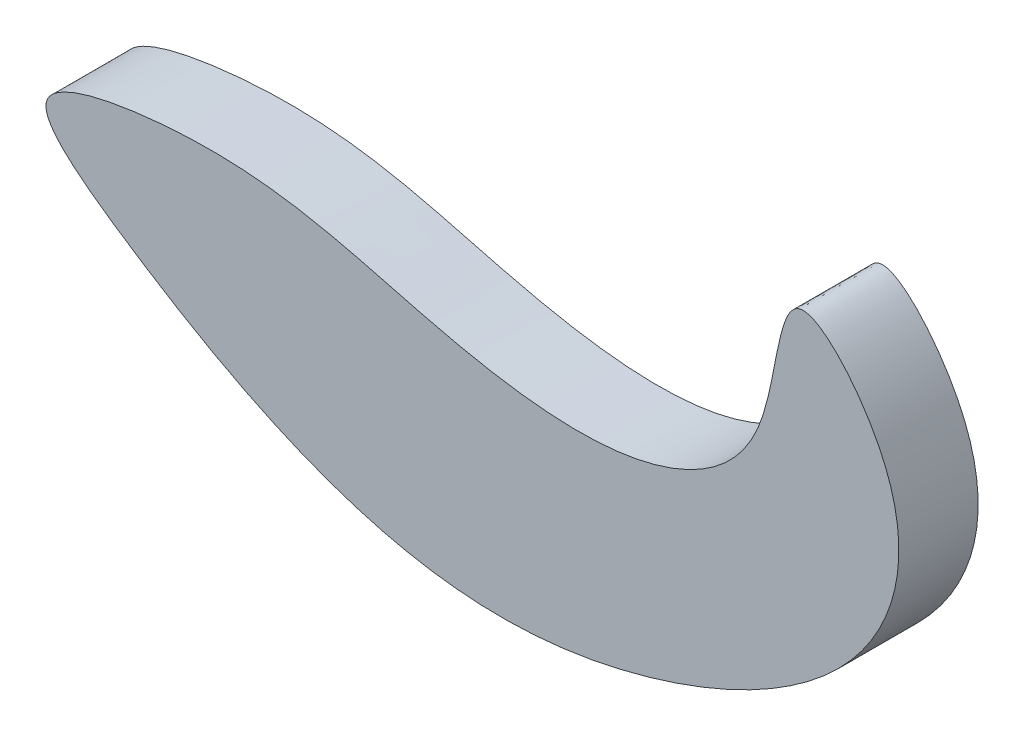
ISO-10303-21;
HEADER;
FILE_DESCRIPTION(('STEP AP214'),'2;1');
FILE_NAME('part.step','',(''),(''),'','','');
FILE_SCHEMA(('AUTOMOTIVE_DESIGN { 1 0 10303 214 1 1 1 1 }'));
ENDSEC;
DATA;
#1=APPLICATION_CONTEXT('core data for automotive mechanical design processes');
#2=APPLICATION_PROTOCOL_DEFINITION('international standard','automotive_design',2000,#1);
#3=PRODUCT_CONTEXT('',#1,'mechanical');
#4=PRODUCT('Part','Part','',(#3));
#5=PRODUCT_RELATED_PRODUCT_CATEGORY('part','',(#4));
#6=PRODUCT_DEFINITION_FORMATION('','',#4);
#7=PRODUCT_DEFINITION_CONTEXT('part definition',#1,'design');
#8=PRODUCT_DEFINITION('design','',#6,#7);
#9=PRODUCT_DEFINITION_SHAPE('','',#8);
#10=(LENGTH_UNIT() NAMED_UNIT(*) SI_UNIT(.MILLI.,.METRE.));
#11=(NAMED_UNIT(*) PLANE_ANGLE_UNIT() SI_UNIT($,.RADIAN.));
#12=(NAMED_UNIT(*) SI_UNIT($,.STERADIAN.) SOLID_ANGLE_UNIT());
#13=UNCERTAINTY_MEASURE_WITH_UNIT(LENGTH_MEASURE(1.E-05),#10,'distance_accuracy_value','');
#14=(GEOMETRIC_REPRESENTATION_CONTEXT(3) GLOBAL_UNCERTAINTY_ASSIGNED_CONTEXT((#13)) GLOBAL_UNIT_ASSIGNED_CONTEXT((#10,
#11,#12)) REPRESENTATION_CONTEXT('',''));
#15=CARTESIAN_POINT('',(0.,0.,0.));
#16=DIRECTION('',(0.,0.,1.));
#17=DIRECTION('',(1.,0.,0.));
#18=AXIS2_PLACEMENT_3D('',#15,#16,#17);
#19=CARTESIAN_POINT('',(44.5526490417657,0.689074863695451,7.08322241660249));
#20=CARTESIAN_POINT('',(44.3532815351249,-0.429169197942402,7.08322241660249));
#21=CARTESIAN_POINT('',(57.1130895614998,-9.73716104146235,7.08322241660249));
#22=CARTESIAN_POINT('',(70.9103641093885,-13.3424807484553,7.08322241660249));
#23=CARTESIAN_POINT('',(88.9983732101198,-4.19561546012167,7.08322241660249));
#24=CARTESIAN_POINT('',(90.0537349474298,5.89412552944585,7.08322241660249));
#25=CARTESIAN_POINT('',(82.9331126136076,13.9353095668468,7.08322241660249));
#26=CARTESIAN_POINT('',(82.9781444703539,4.11032717892562,7.08322241660249));
#27=CARTESIAN_POINT('',(76.3359356671514,-1.22657043237641,7.08322241660249));
#28=CARTESIAN_POINT('',(63.8057740347335,0.540321643852764,7.08322241660249));
#29=CARTESIAN_POINT('',(55.3315909358661,3.92263130384258,7.08322241660249));
#30=CARTESIAN_POINT('',(44.7755486904425,1.9393097323243,7.08322241660249));
#31=CARTESIAN_POINT('',(44.5526490417657,0.689074863695451,7.08322241660249));
#32=B_SPLINE_CURVE_WITH_KNOTS('',3,(#19,#20,#21,#22,#23,#24,#25,#26,#27,#28,#29,#30,#31),
.UNSPECIFIED.,.T.,.F.,(4,1,1,1,1,1,1,1,1,1,4),(0.,0.0539429542934804,0.308391360799523,
0.445919449081173,0.522206306637485,0.576149260930965,0.636459317284658,0.690402271578138,
0.804832557912606,0.939689943646307,1.),.UNSPECIFIED.);
#33=DIRECTION('',(0.,0.,-1.));
#34=VECTOR('',#33,1.);
#35=SURFACE_OF_LINEAR_EXTRUSION('',#32,#34);
#36=CARTESIAN_POINT('',(44.5526490417657,0.689074863695451,7.08322241660249));
#37=VERTEX_POINT('',#36);
#38=EDGE_CURVE('E10',#37,#37,#32,.T.);
#39=ORIENTED_EDGE('',*,*,#38,.F.);
#40=EDGE_LOOP('',(#39));
#41=FACE_BOUND('',#40,.T.);
#42=CARTESIAN_POINT('',(44.5526490417657,0.689074863695451,2.91722241660249));
#43=CARTESIAN_POINT('',(44.3532815351249,-0.429169197942402,2.91722241660249));
#44=CARTESIAN_POINT('',(57.1130895614998,-9.73716104146235,2.91722241660249));
#45=CARTESIAN_POINT('',(70.9103641093885,-13.3424807484553,2.91722241660249));
#46=CARTESIAN_POINT('',(88.9983732101198,-4.19561546012167,2.91722241660249));
#47=CARTESIAN_POINT('',(90.0537349474298,5.89412552944585,2.91722241660249));
#48=CARTESIAN_POINT('',(82.9331126136076,13.9353095668468,2.91722241660249));
#49=CARTESIAN_POINT('',(82.9781444703539,4.11032717892562,2.91722241660249));
#50=CARTESIAN_POINT('',(76.3359356671514,-1.22657043237641,2.91722241660249));
#51=CARTESIAN_POINT('',(63.8057740347335,0.540321643852764,2.91722241660249));
#52=CARTESIAN_POINT('',(55.3315909358661,3.92263130384258,2.91722241660249));
#53=CARTESIAN_POINT('',(44.7755486904425,1.9393097323243,2.91722241660249));
#54=CARTESIAN_POINT('',(44.5526490417657,0.689074863695451,2.91722241660249));
#55=B_SPLINE_CURVE_WITH_KNOTS('',3,(#42,#43,#44,#45,#46,#47,#48,#49,#50,#51,#52,#53,#54),
.UNSPECIFIED.,.T.,.F.,(4,1,1,1,1,1,1,1,1,1,4),(0.,0.0539429542934804,0.308391360799523,
0.445919449081173,0.522206306637485,0.576149260930965,0.636459317284658,0.690402271578138,
0.804832557912606,0.939689943646307,1.),.UNSPECIFIED.);
#56=CARTESIAN_POINT('',(44.5526490417657,0.689074863695451,2.91722241660249));
#57=VERTEX_POINT('',#56);
#58=EDGE_CURVE('E42',#57,#57,#55,.T.);
#59=ORIENTED_EDGE('',*,*,#58,.T.);
#60=EDGE_LOOP('',(#59));
#61=FACE_BOUND('',#60,.T.);
#62=ADVANCED_FACE('F38',(#41,#61),#35,.F.);
#63=CARTESIAN_POINT('',(89.1982181717987,4.30988199778951,7.08322241660249));
#64=DIRECTION('',(0.,0.,1.));
#65=DIRECTION('',(1.,0.,0.));
#66=AXIS2_PLACEMENT_3D('',#63,#64,#65);
#67=PLANE('',#66);
#68=ORIENTED_EDGE('',*,*,#38,.T.);
#69=EDGE_LOOP('',(#68));
#70=FACE_BOUND('',#69,.T.);
#71=ADVANCED_FACE('F61',(#70),#67,.T.);
#72=CARTESIAN_POINT('',(89.1982181717987,4.30988199778951,2.91722241660249));
#73=DIRECTION('',(0.,0.,1.));
#74=DIRECTION('',(1.,0.,0.));
#75=AXIS2_PLACEMENT_3D('',#72,#73,#74);
#76=PLANE('',#75);
#77=ORIENTED_EDGE('',*,*,#58,.F.);
#78=EDGE_LOOP('',(#77));
#79=FACE_BOUND('',#78,.T.);
#80=ADVANCED_FACE('F59',(#79),#76,.F.);
#81=CLOSED_SHELL('',(#62,#71,#80));
#82=MANIFOLD_SOLID_BREP('B2',#81);
#83=ADVANCED_BREP_SHAPE_REPRESENTATION('',(#18,#82),#14);
#84=SHAPE_DEFINITION_REPRESENTATION(#9,#83);
ENDSEC;
END-ISO-10303-21;
